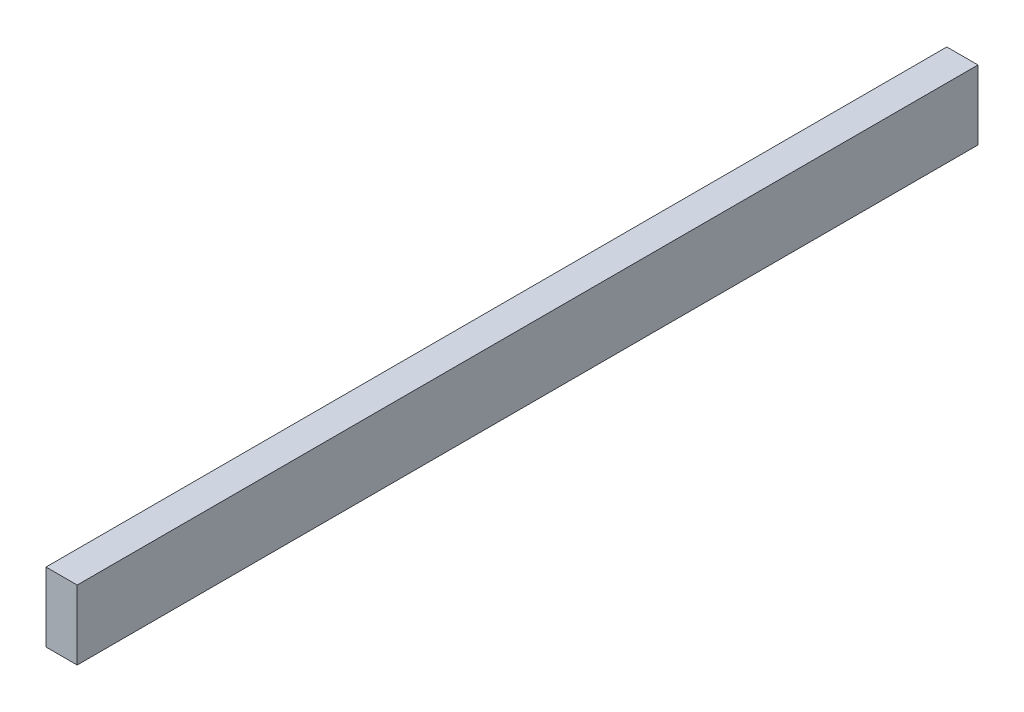
ISO-10303-21;
HEADER;
FILE_DESCRIPTION(('STEP AP214'),'2;1');
FILE_NAME('part.step','',(''),(''),'','','');
FILE_SCHEMA(('AUTOMOTIVE_DESIGN { 1 0 10303 214 1 1 1 1 }'));
ENDSEC;
DATA;
#1=APPLICATION_CONTEXT('core data for automotive mechanical design processes');
#2=APPLICATION_PROTOCOL_DEFINITION('international standard','automotive_design',2000,#1);
#3=PRODUCT_CONTEXT('',#1,'mechanical');
#4=PRODUCT('Part','Part','',(#3));
#5=PRODUCT_RELATED_PRODUCT_CATEGORY('part','',(#4));
#6=PRODUCT_DEFINITION_FORMATION('','',#4);
#7=PRODUCT_DEFINITION_CONTEXT('part definition',#1,'design');
#8=PRODUCT_DEFINITION('design','',#6,#7);
#9=PRODUCT_DEFINITION_SHAPE('','',#8);
#10=(LENGTH_UNIT() NAMED_UNIT(*) SI_UNIT(.MILLI.,.METRE.));
#11=(NAMED_UNIT(*) PLANE_ANGLE_UNIT() SI_UNIT($,.RADIAN.));
#12=(NAMED_UNIT(*) SI_UNIT($,.STERADIAN.) SOLID_ANGLE_UNIT());
#13=UNCERTAINTY_MEASURE_WITH_UNIT(LENGTH_MEASURE(1.E-05),#10,'distance_accuracy_value','');
#14=(GEOMETRIC_REPRESENTATION_CONTEXT(3) GLOBAL_UNCERTAINTY_ASSIGNED_CONTEXT((#13)) GLOBAL_UNIT_ASSIGNED_CONTEXT((#10,
#11,#12)) REPRESENTATION_CONTEXT('',''));
#15=CARTESIAN_POINT('',(0.,0.,0.));
#16=DIRECTION('',(0.,0.,1.));
#17=DIRECTION('',(1.,0.,0.));
#18=AXIS2_PLACEMENT_3D('',#15,#16,#17);
#19=CARTESIAN_POINT('',(0.,0.,780.));
#20=DIRECTION('',(1.,0.,0.));
#21=DIRECTION('',(0.,0.,-1.));
#22=AXIS2_PLACEMENT_3D('',#19,#20,#21);
#23=PLANE('',#22);
#24=DIRECTION('',(0.,-1.,0.));
#25=VECTOR('',#24,1.);
#26=CARTESIAN_POINT('',(0.,0.,0.));
#27=LINE('',#26,#25);
#28=CARTESIAN_POINT('',(0.,60.,0.));
#29=VERTEX_POINT('',#28);
#30=CARTESIAN_POINT('',(0.,0.,0.));
#31=VERTEX_POINT('',#30);
#32=EDGE_CURVE('E96',#29,#31,#27,.T.);
#33=ORIENTED_EDGE('',*,*,#32,.T.);
#34=DIRECTION('',(0.,0.,-1.));
#35=VECTOR('',#34,1.);
#36=CARTESIAN_POINT('',(0.,0.,780.));
#37=LINE('',#36,#35);
#38=CARTESIAN_POINT('',(0.,0.,780.));
#39=VERTEX_POINT('',#38);
#40=EDGE_CURVE('E11',#39,#31,#37,.T.);
#41=ORIENTED_EDGE('',*,*,#40,.F.);
#42=DIRECTION('',(0.,-1.,0.));
#43=VECTOR('',#42,1.);
#44=CARTESIAN_POINT('',(0.,0.,780.));
#45=LINE('',#44,#43);
#46=CARTESIAN_POINT('',(0.,60.,780.));
#47=VERTEX_POINT('',#46);
#48=EDGE_CURVE('E84',#47,#39,#45,.T.);
#49=ORIENTED_EDGE('',*,*,#48,.F.);
#50=DIRECTION('',(0.,0.,-1.));
#51=VECTOR('',#50,1.);
#52=CARTESIAN_POINT('',(0.,60.,780.));
#53=LINE('',#52,#51);
#54=EDGE_CURVE('E92',#47,#29,#53,.T.);
#55=ORIENTED_EDGE('',*,*,#54,.T.);
#56=EDGE_LOOP('',(#33,#41,#49,#55));
#57=FACE_BOUND('',#56,.T.);
#58=ADVANCED_FACE('F33',(#57),#23,.F.);
#59=CARTESIAN_POINT('',(0.,0.,780.));
#60=DIRECTION('',(0.,1.,0.));
#61=DIRECTION('',(0.,0.,1.));
#62=AXIS2_PLACEMENT_3D('',#59,#60,#61);
#63=PLANE('',#62);
#64=DIRECTION('',(1.,0.,0.));
#65=VECTOR('',#64,1.);
#66=CARTESIAN_POINT('',(0.,0.,0.));
#67=LINE('',#66,#65);
#68=CARTESIAN_POINT('',(27.,0.,0.));
#69=VERTEX_POINT('',#68);
#70=EDGE_CURVE('E88',#31,#69,#67,.T.);
#71=ORIENTED_EDGE('',*,*,#70,.T.);
#72=DIRECTION('',(0.,0.,-1.));
#73=VECTOR('',#72,1.);
#74=CARTESIAN_POINT('',(27.,0.,780.));
#75=LINE('',#74,#73);
#76=CARTESIAN_POINT('',(27.,0.,780.));
#77=VERTEX_POINT('',#76);
#78=EDGE_CURVE('E41',#77,#69,#75,.T.);
#79=ORIENTED_EDGE('',*,*,#78,.F.);
#80=DIRECTION('',(1.,0.,0.));
#81=VECTOR('',#80,1.);
#82=CARTESIAN_POINT('',(0.,0.,780.));
#83=LINE('',#82,#81);
#84=EDGE_CURVE('E79',#39,#77,#83,.T.);
#85=ORIENTED_EDGE('',*,*,#84,.F.);
#86=ORIENTED_EDGE('',*,*,#40,.T.);
#87=EDGE_LOOP('',(#71,#79,#85,#86));
#88=FACE_BOUND('',#87,.T.);
#89=ADVANCED_FACE('F87',(#88),#63,.F.);
#90=CARTESIAN_POINT('',(27.,0.,780.));
#91=DIRECTION('',(-1.,0.,0.));
#92=DIRECTION('',(0.,0.,1.));
#93=AXIS2_PLACEMENT_3D('',#90,#91,#92);
#94=PLANE('',#93);
#95=DIRECTION('',(0.,1.,0.));
#96=VECTOR('',#95,1.);
#97=CARTESIAN_POINT('',(27.,0.,0.));
#98=LINE('',#97,#96);
#99=CARTESIAN_POINT('',(27.,60.,0.));
#100=VERTEX_POINT('',#99);
#101=EDGE_CURVE('E66',#69,#100,#98,.T.);
#102=ORIENTED_EDGE('',*,*,#101,.T.);
#103=DIRECTION('',(0.,0.,-1.));
#104=VECTOR('',#103,1.);
#105=CARTESIAN_POINT('',(27.,60.,780.));
#106=LINE('',#105,#104);
#107=CARTESIAN_POINT('',(27.,60.,780.));
#108=VERTEX_POINT('',#107);
#109=EDGE_CURVE('E89',#108,#100,#106,.T.);
#110=ORIENTED_EDGE('',*,*,#109,.F.);
#111=DIRECTION('',(0.,1.,0.));
#112=VECTOR('',#111,1.);
#113=CARTESIAN_POINT('',(27.,0.,780.));
#114=LINE('',#113,#112);
#115=EDGE_CURVE('E82',#77,#108,#114,.T.);
#116=ORIENTED_EDGE('',*,*,#115,.F.);
#117=ORIENTED_EDGE('',*,*,#78,.T.);
#118=EDGE_LOOP('',(#102,#110,#116,#117));
#119=FACE_BOUND('',#118,.T.);
#120=ADVANCED_FACE('F90',(#119),#94,.F.);
#121=CARTESIAN_POINT('',(0.,60.,780.));
#122=DIRECTION('',(0.,-1.,0.));
#123=DIRECTION('',(0.,0.,-1.));
#124=AXIS2_PLACEMENT_3D('',#121,#122,#123);
#125=PLANE('',#124);
#126=DIRECTION('',(-1.,0.,0.));
#127=VECTOR('',#126,1.);
#128=CARTESIAN_POINT('',(0.,60.,0.));
#129=LINE('',#128,#127);
#130=EDGE_CURVE('E72',#100,#29,#129,.T.);
#131=ORIENTED_EDGE('',*,*,#130,.T.);
#132=ORIENTED_EDGE('',*,*,#54,.F.);
#133=DIRECTION('',(-1.,0.,0.));
#134=VECTOR('',#133,1.);
#135=CARTESIAN_POINT('',(0.,60.,780.));
#136=LINE('',#135,#134);
#137=EDGE_CURVE('E49',#108,#47,#136,.T.);
#138=ORIENTED_EDGE('',*,*,#137,.F.);
#139=ORIENTED_EDGE('',*,*,#109,.T.);
#140=EDGE_LOOP('',(#131,#132,#138,#139));
#141=FACE_BOUND('',#140,.T.);
#142=ADVANCED_FACE('F103',(#141),#125,.F.);
#143=CARTESIAN_POINT('',(0.,0.,780.));
#144=DIRECTION('',(0.,0.,-1.));
#145=DIRECTION('',(-1.,0.,0.));
#146=AXIS2_PLACEMENT_3D('',#143,#144,#145);
#147=PLANE('',#146);
#148=ORIENTED_EDGE('',*,*,#48,.T.);
#149=ORIENTED_EDGE('',*,*,#84,.T.);
#150=ORIENTED_EDGE('',*,*,#115,.T.);
#151=ORIENTED_EDGE('',*,*,#137,.T.);
#152=EDGE_LOOP('',(#148,#149,#150,#151));
#153=FACE_BOUND('',#152,.T.);
#154=ADVANCED_FACE('F80',(#153),#147,.F.);
#155=CARTESIAN_POINT('',(0.,0.,0.));
#156=DIRECTION('',(0.,0.,-1.));
#157=DIRECTION('',(-1.,0.,0.));
#158=AXIS2_PLACEMENT_3D('',#155,#156,#157);
#159=PLANE('',#158);
#160=ORIENTED_EDGE('',*,*,#32,.F.);
#161=ORIENTED_EDGE('',*,*,#130,.F.);
#162=ORIENTED_EDGE('',*,*,#101,.F.);
#163=ORIENTED_EDGE('',*,*,#70,.F.);
#164=EDGE_LOOP('',(#160,#161,#162,#163));
#165=FACE_BOUND('',#164,.T.);
#166=ADVANCED_FACE('F106',(#165),#159,.T.);
#167=CLOSED_SHELL('',(#58,#89,#120,#142,#154,#166));
#168=MANIFOLD_SOLID_BREP('B2',#167);
#169=ADVANCED_BREP_SHAPE_REPRESENTATION('',(#18,#168),#14);
#170=SHAPE_DEFINITION_REPRESENTATION(#9,#169);
ENDSEC;
END-ISO-10303-21;
